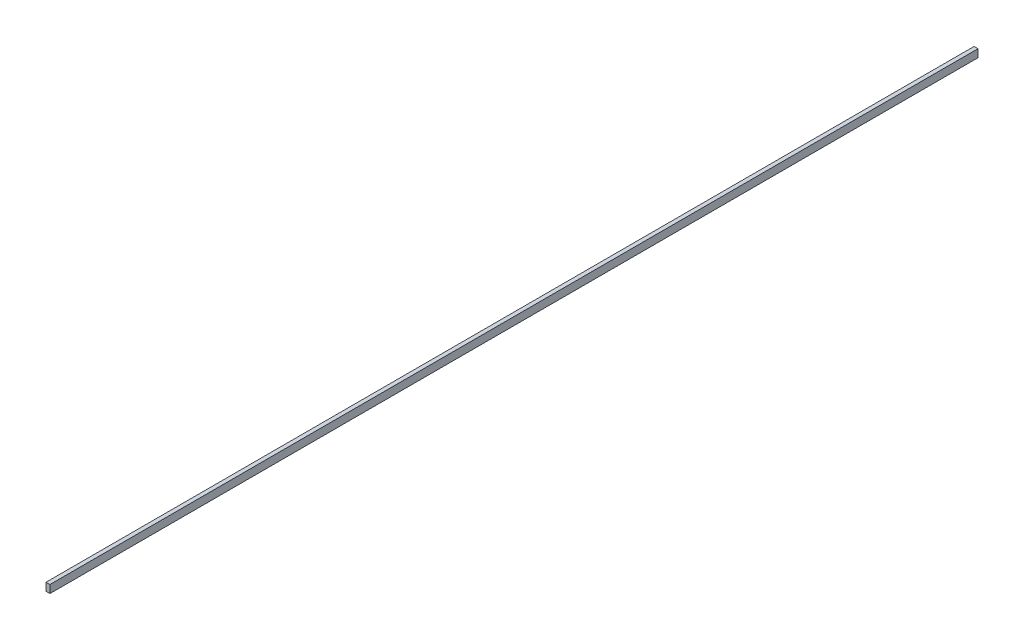
ISO-10303-21;
HEADER;
FILE_DESCRIPTION(('STEP AP214'),'2;1');
FILE_NAME('part.step','',(''),(''),'','','');
FILE_SCHEMA(('AUTOMOTIVE_DESIGN { 1 0 10303 214 1 1 1 1 }'));
ENDSEC;
DATA;
#1=APPLICATION_CONTEXT('core data for automotive mechanical design processes');
#2=APPLICATION_PROTOCOL_DEFINITION('international standard','automotive_design',2000,#1);
#3=PRODUCT_CONTEXT('',#1,'mechanical');
#4=PRODUCT('Part','Part','',(#3));
#5=PRODUCT_RELATED_PRODUCT_CATEGORY('part','',(#4));
#6=PRODUCT_DEFINITION_FORMATION('','',#4);
#7=PRODUCT_DEFINITION_CONTEXT('part definition',#1,'design');
#8=PRODUCT_DEFINITION('design','',#6,#7);
#9=PRODUCT_DEFINITION_SHAPE('','',#8);
#10=(LENGTH_UNIT() NAMED_UNIT(*) SI_UNIT(.MILLI.,.METRE.));
#11=(NAMED_UNIT(*) PLANE_ANGLE_UNIT() SI_UNIT($,.RADIAN.));
#12=(NAMED_UNIT(*) SI_UNIT($,.STERADIAN.) SOLID_ANGLE_UNIT());
#13=UNCERTAINTY_MEASURE_WITH_UNIT(LENGTH_MEASURE(1.E-05),#10,'distance_accuracy_value','');
#14=(GEOMETRIC_REPRESENTATION_CONTEXT(3) GLOBAL_UNCERTAINTY_ASSIGNED_CONTEXT((#13)) GLOBAL_UNIT_ASSIGNED_CONTEXT((#10,
#11,#12)) REPRESENTATION_CONTEXT('',''));
#15=CARTESIAN_POINT('',(0.,0.,0.));
#16=DIRECTION('',(0.,0.,1.));
#17=DIRECTION('',(1.,0.,0.));
#18=AXIS2_PLACEMENT_3D('',#15,#16,#17);
#19=CARTESIAN_POINT('',(0.,0.,6000.));
#20=DIRECTION('',(1.,0.,0.));
#21=DIRECTION('',(0.,1.,0.));
#22=AXIS2_PLACEMENT_3D('',#19,#20,#21);
#23=PLANE('',#22);
#24=DIRECTION('',(0.,-1.,0.));
#25=VECTOR('',#24,1.);
#26=CARTESIAN_POINT('',(0.,0.,0.));
#27=LINE('',#26,#25);
#28=CARTESIAN_POINT('',(0.,0.,0.));
#29=VERTEX_POINT('',#28);
#30=CARTESIAN_POINT('',(0.,-50.8,0.));
#31=VERTEX_POINT('',#30);
#32=EDGE_CURVE('E98',#29,#31,#27,.T.);
#33=ORIENTED_EDGE('',*,*,#32,.T.);
#34=DIRECTION('',(0.,0.,-1.));
#35=VECTOR('',#34,1.);
#36=CARTESIAN_POINT('',(0.,-50.8,6000.));
#37=LINE('',#36,#35);
#38=CARTESIAN_POINT('',(0.,-50.8,6000.));
#39=VERTEX_POINT('',#38);
#40=EDGE_CURVE('E11',#39,#31,#37,.T.);
#41=ORIENTED_EDGE('',*,*,#40,.F.);
#42=DIRECTION('',(0.,-1.,0.));
#43=VECTOR('',#42,1.);
#44=CARTESIAN_POINT('',(0.,0.,6000.));
#45=LINE('',#44,#43);
#46=CARTESIAN_POINT('',(0.,0.,6000.));
#47=VERTEX_POINT('',#46);
#48=EDGE_CURVE('E86',#47,#39,#45,.T.);
#49=ORIENTED_EDGE('',*,*,#48,.F.);
#50=DIRECTION('',(0.,0.,-1.));
#51=VECTOR('',#50,1.);
#52=CARTESIAN_POINT('',(0.,0.,6000.));
#53=LINE('',#52,#51);
#54=EDGE_CURVE('E94',#47,#29,#53,.T.);
#55=ORIENTED_EDGE('',*,*,#54,.T.);
#56=EDGE_LOOP('',(#33,#41,#49,#55));
#57=FACE_BOUND('',#56,.T.);
#58=ADVANCED_FACE('F35',(#57),#23,.F.);
#59=CARTESIAN_POINT('',(0.,-50.8,6000.));
#60=DIRECTION('',(0.,1.,0.));
#61=DIRECTION('',(0.,0.,1.));
#62=AXIS2_PLACEMENT_3D('',#59,#60,#61);
#63=PLANE('',#62);
#64=DIRECTION('',(1.,0.,0.));
#65=VECTOR('',#64,1.);
#66=CARTESIAN_POINT('',(0.,-50.8,0.));
#67=LINE('',#66,#65);
#68=CARTESIAN_POINT('',(25.4,-50.8,0.));
#69=VERTEX_POINT('',#68);
#70=EDGE_CURVE('E90',#31,#69,#67,.T.);
#71=ORIENTED_EDGE('',*,*,#70,.T.);
#72=DIRECTION('',(0.,0.,-1.));
#73=VECTOR('',#72,1.);
#74=CARTESIAN_POINT('',(25.4,-50.8,6000.));
#75=LINE('',#74,#73);
#76=CARTESIAN_POINT('',(25.4,-50.8,6000.));
#77=VERTEX_POINT('',#76);
#78=EDGE_CURVE('E43',#77,#69,#75,.T.);
#79=ORIENTED_EDGE('',*,*,#78,.F.);
#80=DIRECTION('',(1.,0.,0.));
#81=VECTOR('',#80,1.);
#82=CARTESIAN_POINT('',(0.,-50.8,6000.));
#83=LINE('',#82,#81);
#84=EDGE_CURVE('E81',#39,#77,#83,.T.);
#85=ORIENTED_EDGE('',*,*,#84,.F.);
#86=ORIENTED_EDGE('',*,*,#40,.T.);
#87=EDGE_LOOP('',(#71,#79,#85,#86));
#88=FACE_BOUND('',#87,.T.);
#89=ADVANCED_FACE('F89',(#88),#63,.F.);
#90=CARTESIAN_POINT('',(25.4,0.,6000.));
#91=DIRECTION('',(-1.,0.,0.));
#92=DIRECTION('',(0.,-1.,0.));
#93=AXIS2_PLACEMENT_3D('',#90,#91,#92);
#94=PLANE('',#93);
#95=DIRECTION('',(0.,1.,0.));
#96=VECTOR('',#95,1.);
#97=CARTESIAN_POINT('',(25.4,0.,0.));
#98=LINE('',#97,#96);
#99=CARTESIAN_POINT('',(25.4,0.,0.));
#100=VERTEX_POINT('',#99);
#101=EDGE_CURVE('E68',#69,#100,#98,.T.);
#102=ORIENTED_EDGE('',*,*,#101,.T.);
#103=DIRECTION('',(0.,0.,-1.));
#104=VECTOR('',#103,1.);
#105=CARTESIAN_POINT('',(25.4,0.,6000.));
#106=LINE('',#105,#104);
#107=CARTESIAN_POINT('',(25.4,0.,6000.));
#108=VERTEX_POINT('',#107);
#109=EDGE_CURVE('E91',#108,#100,#106,.T.);
#110=ORIENTED_EDGE('',*,*,#109,.F.);
#111=DIRECTION('',(0.,1.,0.));
#112=VECTOR('',#111,1.);
#113=CARTESIAN_POINT('',(25.4,0.,6000.));
#114=LINE('',#113,#112);
#115=EDGE_CURVE('E84',#77,#108,#114,.T.);
#116=ORIENTED_EDGE('',*,*,#115,.F.);
#117=ORIENTED_EDGE('',*,*,#78,.T.);
#118=EDGE_LOOP('',(#102,#110,#116,#117));
#119=FACE_BOUND('',#118,.T.);
#120=ADVANCED_FACE('F92',(#119),#94,.F.);
#121=CARTESIAN_POINT('',(0.,0.,6000.));
#122=DIRECTION('',(0.,-1.,0.));
#123=DIRECTION('',(0.,0.,-1.));
#124=AXIS2_PLACEMENT_3D('',#121,#122,#123);
#125=PLANE('',#124);
#126=DIRECTION('',(-1.,0.,0.));
#127=VECTOR('',#126,1.);
#128=CARTESIAN_POINT('',(0.,0.,0.));
#129=LINE('',#128,#127);
#130=EDGE_CURVE('E74',#100,#29,#129,.T.);
#131=ORIENTED_EDGE('',*,*,#130,.T.);
#132=ORIENTED_EDGE('',*,*,#54,.F.);
#133=DIRECTION('',(-1.,0.,0.));
#134=VECTOR('',#133,1.);
#135=CARTESIAN_POINT('',(0.,0.,6000.));
#136=LINE('',#135,#134);
#137=EDGE_CURVE('E51',#108,#47,#136,.T.);
#138=ORIENTED_EDGE('',*,*,#137,.F.);
#139=ORIENTED_EDGE('',*,*,#109,.T.);
#140=EDGE_LOOP('',(#131,#132,#138,#139));
#141=FACE_BOUND('',#140,.T.);
#142=ADVANCED_FACE('F105',(#141),#125,.F.);
#143=CARTESIAN_POINT('',(0.,0.,6000.));
#144=DIRECTION('',(0.,0.,1.));
#145=DIRECTION('',(1.,0.,0.));
#146=AXIS2_PLACEMENT_3D('',#143,#144,#145);
#147=PLANE('',#146);
#148=ORIENTED_EDGE('',*,*,#48,.T.);
#149=ORIENTED_EDGE('',*,*,#84,.T.);
#150=ORIENTED_EDGE('',*,*,#115,.T.);
#151=ORIENTED_EDGE('',*,*,#137,.T.);
#152=EDGE_LOOP('',(#148,#149,#150,#151));
#153=FACE_BOUND('',#152,.T.);
#154=ADVANCED_FACE('F82',(#153),#147,.T.);
#155=CARTESIAN_POINT('',(0.,0.,0.));
#156=DIRECTION('',(0.,0.,1.));
#157=DIRECTION('',(1.,0.,0.));
#158=AXIS2_PLACEMENT_3D('',#155,#156,#157);
#159=PLANE('',#158);
#160=ORIENTED_EDGE('',*,*,#32,.F.);
#161=ORIENTED_EDGE('',*,*,#130,.F.);
#162=ORIENTED_EDGE('',*,*,#101,.F.);
#163=ORIENTED_EDGE('',*,*,#70,.F.);
#164=EDGE_LOOP('',(#160,#161,#162,#163));
#165=FACE_BOUND('',#164,.T.);
#166=ADVANCED_FACE('F108',(#165),#159,.F.);
#167=CLOSED_SHELL('',(#58,#89,#120,#142,#154,#166));
#168=MANIFOLD_SOLID_BREP('B2',#167);
#169=ADVANCED_BREP_SHAPE_REPRESENTATION('',(#18,#168),#14);
#170=SHAPE_DEFINITION_REPRESENTATION(#9,#169);
ENDSEC;
END-ISO-10303-21;
